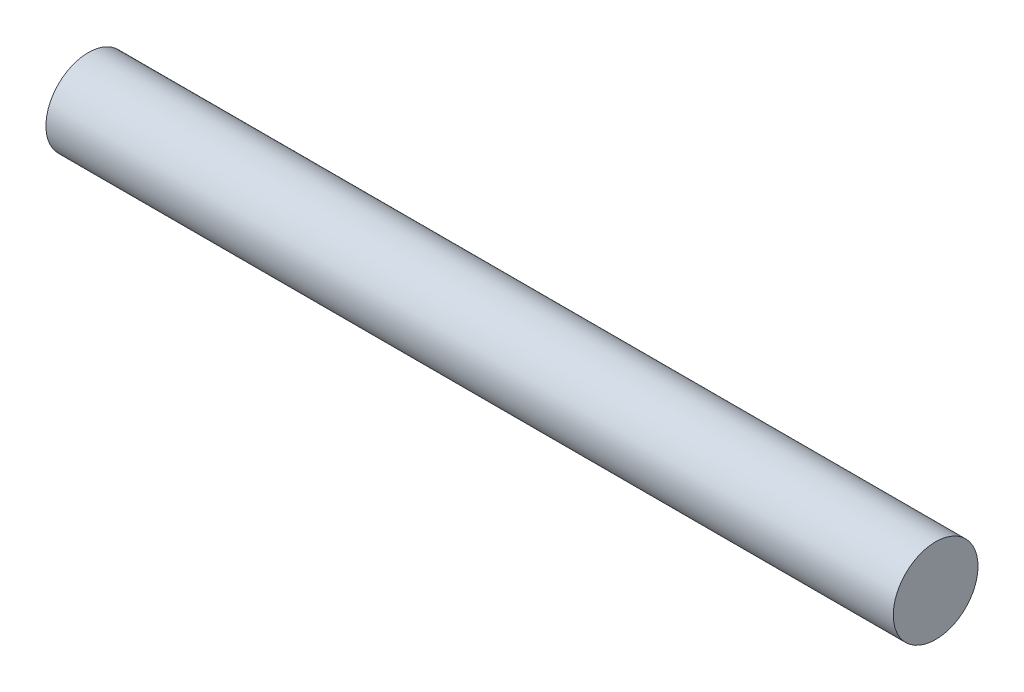
ISO-10303-21;
HEADER;
FILE_DESCRIPTION(('STEP AP214'),'2;1');
FILE_NAME('part.step','',(''),(''),'','','');
FILE_SCHEMA(('AUTOMOTIVE_DESIGN { 1 0 10303 214 1 1 1 1 }'));
ENDSEC;
DATA;
#1=APPLICATION_CONTEXT('core data for automotive mechanical design processes');
#2=APPLICATION_PROTOCOL_DEFINITION('international standard','automotive_design',2000,#1);
#3=PRODUCT_CONTEXT('',#1,'mechanical');
#4=PRODUCT('Part','Part','',(#3));
#5=PRODUCT_RELATED_PRODUCT_CATEGORY('part','',(#4));
#6=PRODUCT_DEFINITION_FORMATION('','',#4);
#7=PRODUCT_DEFINITION_CONTEXT('part definition',#1,'design');
#8=PRODUCT_DEFINITION('design','',#6,#7);
#9=PRODUCT_DEFINITION_SHAPE('','',#8);
#10=(LENGTH_UNIT() NAMED_UNIT(*) SI_UNIT(.MILLI.,.METRE.));
#11=(NAMED_UNIT(*) PLANE_ANGLE_UNIT() SI_UNIT($,.RADIAN.));
#12=(NAMED_UNIT(*) SI_UNIT($,.STERADIAN.) SOLID_ANGLE_UNIT());
#13=UNCERTAINTY_MEASURE_WITH_UNIT(LENGTH_MEASURE(1.E-05),#10,'distance_accuracy_value','');
#14=(GEOMETRIC_REPRESENTATION_CONTEXT(3) GLOBAL_UNCERTAINTY_ASSIGNED_CONTEXT((#13)) GLOBAL_UNIT_ASSIGNED_CONTEXT((#10,
#11,#12)) REPRESENTATION_CONTEXT('',''));
#15=CARTESIAN_POINT('',(0.,0.,0.));
#16=DIRECTION('',(0.,0.,1.));
#17=DIRECTION('',(1.,0.,0.));
#18=AXIS2_PLACEMENT_3D('',#15,#16,#17);
#19=CARTESIAN_POINT('',(20.,0.,0.));
#20=DIRECTION('',(-1.,0.,0.));
#21=DIRECTION('',(0.,0.,1.));
#22=AXIS2_PLACEMENT_3D('',#19,#20,#21);
#23=CYLINDRICAL_SURFACE('',#22,1.);
#24=CARTESIAN_POINT('',(20.,0.,0.));
#25=DIRECTION('',(1.,0.,0.));
#26=DIRECTION('',(0.,0.,-1.));
#27=AXIS2_PLACEMENT_3D('',#24,#25,#26);
#28=CIRCLE('',#27,1.);
#29=CARTESIAN_POINT('',(20.,0.,-1.));
#30=VERTEX_POINT('',#29);
#31=EDGE_CURVE('E10',#30,#30,#28,.T.);
#32=ORIENTED_EDGE('',*,*,#31,.F.);
#33=EDGE_LOOP('',(#32));
#34=FACE_BOUND('',#33,.T.);
#35=CARTESIAN_POINT('',(0.,0.,0.));
#36=DIRECTION('',(1.,0.,0.));
#37=DIRECTION('',(0.,0.,-1.));
#38=AXIS2_PLACEMENT_3D('',#35,#36,#37);
#39=CIRCLE('',#38,1.);
#40=CARTESIAN_POINT('',(0.,0.,-1.));
#41=VERTEX_POINT('',#40);
#42=EDGE_CURVE('E33',#41,#41,#39,.T.);
#43=ORIENTED_EDGE('',*,*,#42,.T.);
#44=EDGE_LOOP('',(#43));
#45=FACE_BOUND('',#44,.T.);
#46=ADVANCED_FACE('F30',(#34,#45),#23,.T.);
#47=CARTESIAN_POINT('',(20.,0.,0.));
#48=DIRECTION('',(1.,0.,0.));
#49=DIRECTION('',(0.,0.,-1.));
#50=AXIS2_PLACEMENT_3D('',#47,#48,#49);
#51=PLANE('',#50);
#52=ORIENTED_EDGE('',*,*,#31,.T.);
#53=EDGE_LOOP('',(#52));
#54=FACE_BOUND('',#53,.T.);
#55=ADVANCED_FACE('F45',(#54),#51,.T.);
#56=CARTESIAN_POINT('',(0.,0.,0.));
#57=DIRECTION('',(1.,0.,0.));
#58=DIRECTION('',(0.,0.,-1.));
#59=AXIS2_PLACEMENT_3D('',#56,#57,#58);
#60=PLANE('',#59);
#61=ORIENTED_EDGE('',*,*,#42,.F.);
#62=EDGE_LOOP('',(#61));
#63=FACE_BOUND('',#62,.T.);
#64=ADVANCED_FACE('F43',(#63),#60,.F.);
#65=CLOSED_SHELL('',(#46,#55,#64));
#66=MANIFOLD_SOLID_BREP('B2',#65);
#67=ADVANCED_BREP_SHAPE_REPRESENTATION('',(#18,#66),#14);
#68=SHAPE_DEFINITION_REPRESENTATION(#9,#67);
ENDSEC;
END-ISO-10303-21;
